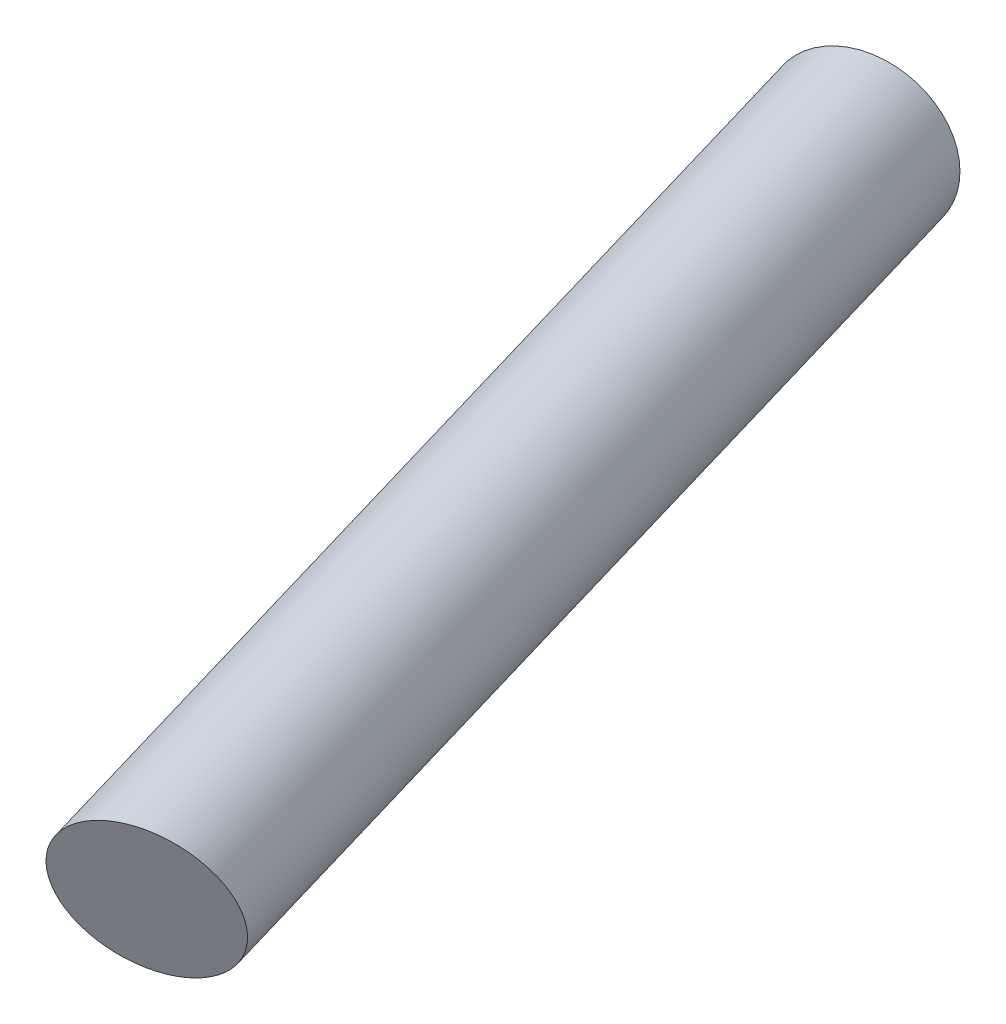
ISO-10303-21;
HEADER;
FILE_DESCRIPTION(('STEP AP214'),'2;1');
FILE_NAME('part.step','',(''),(''),'','','');
FILE_SCHEMA(('AUTOMOTIVE_DESIGN { 1 0 10303 214 1 1 1 1 }'));
ENDSEC;
DATA;
#1=APPLICATION_CONTEXT('core data for automotive mechanical design processes');
#2=APPLICATION_PROTOCOL_DEFINITION('international standard','automotive_design',2000,#1);
#3=PRODUCT_CONTEXT('',#1,'mechanical');
#4=PRODUCT('Part','Part','',(#3));
#5=PRODUCT_RELATED_PRODUCT_CATEGORY('part','',(#4));
#6=PRODUCT_DEFINITION_FORMATION('','',#4);
#7=PRODUCT_DEFINITION_CONTEXT('part definition',#1,'design');
#8=PRODUCT_DEFINITION('design','',#6,#7);
#9=PRODUCT_DEFINITION_SHAPE('','',#8);
#10=(LENGTH_UNIT() NAMED_UNIT(*) SI_UNIT(.MILLI.,.METRE.));
#11=(NAMED_UNIT(*) PLANE_ANGLE_UNIT() SI_UNIT($,.RADIAN.));
#12=(NAMED_UNIT(*) SI_UNIT($,.STERADIAN.) SOLID_ANGLE_UNIT());
#13=UNCERTAINTY_MEASURE_WITH_UNIT(LENGTH_MEASURE(1.E-05),#10,'distance_accuracy_value','');
#14=(GEOMETRIC_REPRESENTATION_CONTEXT(3) GLOBAL_UNCERTAINTY_ASSIGNED_CONTEXT((#13)) GLOBAL_UNIT_ASSIGNED_CONTEXT((#10,
#11,#12)) REPRESENTATION_CONTEXT('',''));
#15=CARTESIAN_POINT('',(0.,0.,0.));
#16=DIRECTION('',(0.,0.,1.));
#17=DIRECTION('',(1.,0.,0.));
#18=AXIS2_PLACEMENT_3D('',#15,#16,#17);
#19=CARTESIAN_POINT('',(-98.4482945486323,-121.206165609529,-60.6838335895624));
#20=DIRECTION('',(0.282166323991551,0.,0.95936550157127));
#21=DIRECTION('',(0.95936550157127,0.,-0.282166323991551));
#22=AXIS2_PLACEMENT_3D('',#19,#20,#21);
#23=CYLINDRICAL_SURFACE('',#22,4.75);
#24=CARTESIAN_POINT('',(-80.2727570463216,-121.206165609529,1.11299391829393));
#25=DIRECTION('',(-0.319734371379646,0.277498724749694,-0.905960479005986));
#26=DIRECTION('',(-0.0870968626907953,0.943495664148958,0.319734371379646));
#27=AXIS2_PLACEMENT_3D('',#24,#25,#26);
#28=ELLIPSE('',#27,4.95118908509879,4.75);
#29=CARTESIAN_POINT('',(-80.7039900822226,-116.534740175357,2.69605924799975));
#30=VERTEX_POINT('',#29);
#31=EDGE_CURVE('E48',#30,#30,#28,.F.);
#32=ORIENTED_EDGE('',*,*,#31,.F.);
#33=EDGE_LOOP('',(#32));
#34=FACE_BOUND('',#33,.T.);
#35=CARTESIAN_POINT('',(-98.4482945486323,-121.206165609529,-60.6838335895624));
#36=DIRECTION('',(0.282166323991551,0.,0.959365501571271));
#37=DIRECTION('',(0.959365501571271,0.,-0.282166323991551));
#38=AXIS2_PLACEMENT_3D('',#35,#36,#37);
#39=CIRCLE('',#38,4.75);
#40=CARTESIAN_POINT('',(-93.8913084161688,-121.206165609529,-62.0241236285223));
#41=VERTEX_POINT('',#40);
#42=EDGE_CURVE('E12',#41,#41,#39,.T.);
#43=ORIENTED_EDGE('',*,*,#42,.T.);
#44=EDGE_LOOP('',(#43));
#45=FACE_BOUND('',#44,.T.);
#46=ADVANCED_FACE('F42',(#34,#45),#23,.T.);
#47=CARTESIAN_POINT('',(-98.4482945486323,-121.206165609529,-60.6838335895624));
#48=DIRECTION('',(0.282166323991551,0.,0.959365501571271));
#49=DIRECTION('',(0.959365501571271,0.,-0.282166323991551));
#50=AXIS2_PLACEMENT_3D('',#47,#48,#49);
#51=PLANE('',#50);
#52=ORIENTED_EDGE('',*,*,#42,.F.);
#53=EDGE_LOOP('',(#52));
#54=FACE_BOUND('',#53,.T.);
#55=ADVANCED_FACE('F57',(#54),#51,.F.);
#56=CARTESIAN_POINT('',(-57.7021390117428,-128.169629987664,-8.98563076315657));
#57=DIRECTION('',(-0.319734371379646,0.277498724749694,-0.905960479005986));
#58=DIRECTION('',(-0.942995686347041,0.,0.332804951181427));
#59=AXIS2_PLACEMENT_3D('',#56,#57,#58);
#60=PLANE('',#59);
#61=ORIENTED_EDGE('',*,*,#31,.T.);
#62=EDGE_LOOP('',(#61));
#63=FACE_BOUND('',#62,.T.);
#64=ADVANCED_FACE('F54',(#63),#60,.F.);
#65=CLOSED_SHELL('',(#46,#55,#64));
#66=MANIFOLD_SOLID_BREP('B2',#65);
#67=ADVANCED_BREP_SHAPE_REPRESENTATION('',(#18,#66),#14);
#68=SHAPE_DEFINITION_REPRESENTATION(#9,#67);
ENDSEC;
END-ISO-10303-21;
